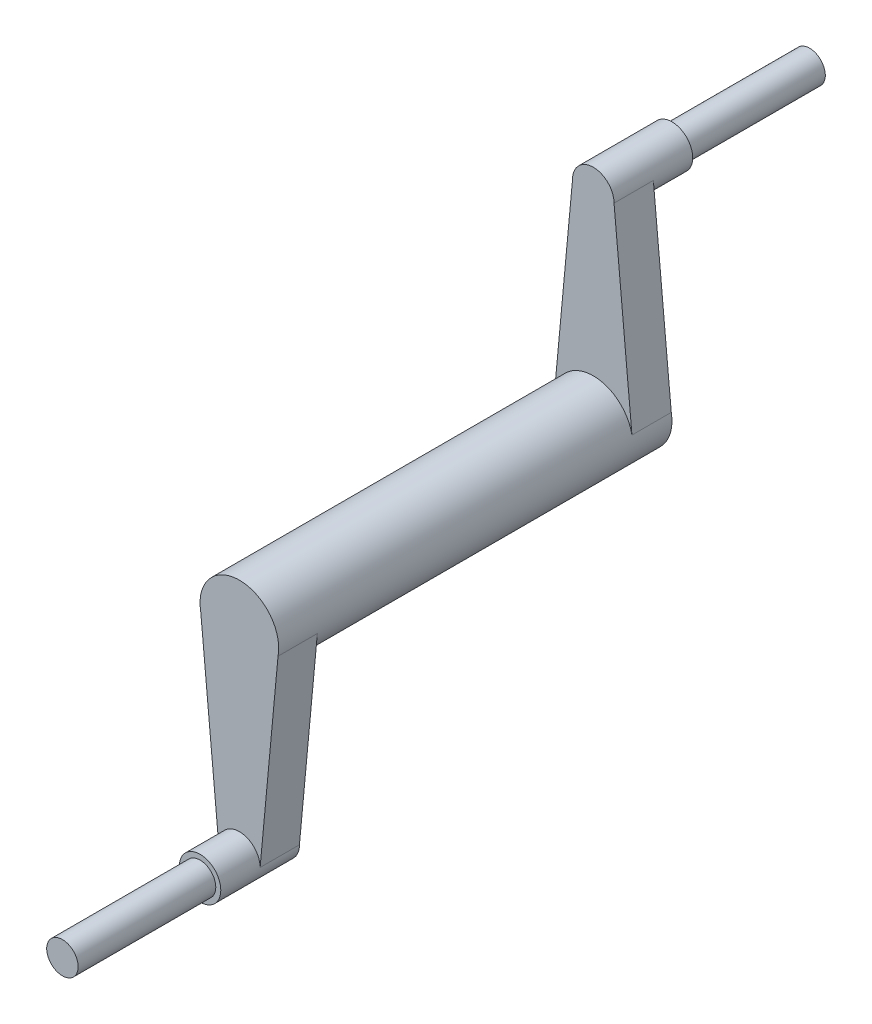
ISO-10303-21;
HEADER;
FILE_DESCRIPTION(('STEP AP214'),'2;1');
FILE_NAME('part.step','',(''),(''),'','','');
FILE_SCHEMA(('AUTOMOTIVE_DESIGN { 1 0 10303 214 1 1 1 1 }'));
ENDSEC;
DATA;
#1=APPLICATION_CONTEXT('core data for automotive mechanical design processes');
#2=APPLICATION_PROTOCOL_DEFINITION('international standard','automotive_design',2000,#1);
#3=PRODUCT_CONTEXT('',#1,'mechanical');
#4=PRODUCT('Part','Part','',(#3));
#5=PRODUCT_RELATED_PRODUCT_CATEGORY('part','',(#4));
#6=PRODUCT_DEFINITION_FORMATION('','',#4);
#7=PRODUCT_DEFINITION_CONTEXT('part definition',#1,'design');
#8=PRODUCT_DEFINITION('design','',#6,#7);
#9=PRODUCT_DEFINITION_SHAPE('','',#8);
#10=(LENGTH_UNIT() NAMED_UNIT(*) SI_UNIT(.MILLI.,.METRE.));
#11=(NAMED_UNIT(*) PLANE_ANGLE_UNIT() SI_UNIT($,.RADIAN.));
#12=(NAMED_UNIT(*) SI_UNIT($,.STERADIAN.) SOLID_ANGLE_UNIT());
#13=UNCERTAINTY_MEASURE_WITH_UNIT(LENGTH_MEASURE(1.E-05),#10,'distance_accuracy_value','');
#14=(GEOMETRIC_REPRESENTATION_CONTEXT(3) GLOBAL_UNCERTAINTY_ASSIGNED_CONTEXT((#13)) GLOBAL_UNIT_ASSIGNED_CONTEXT((#10,
#11,#12)) REPRESENTATION_CONTEXT('',''));
#15=CARTESIAN_POINT('',(0.,0.,0.));
#16=DIRECTION('',(0.,0.,1.));
#17=DIRECTION('',(1.,0.,0.));
#18=AXIS2_PLACEMENT_3D('',#15,#16,#17);
#19=CARTESIAN_POINT('',(0.,101.307517591066,-120.));
#20=DIRECTION('',(0.,0.,-1.));
#21=DIRECTION('',(-1.,0.,0.));
#22=AXIS2_PLACEMENT_3D('',#19,#20,#21);
#23=PLANE('',#22);
#24=CARTESIAN_POINT('',(0.,101.307517591066,-120.));
#25=DIRECTION('',(0.,0.,-1.));
#26=DIRECTION('',(-1.,0.,0.));
#27=AXIS2_PLACEMENT_3D('',#24,#25,#26);
#28=CIRCLE('',#27,10.5484821562841);
#29=CARTESIAN_POINT('',(-10.5484821562841,101.307517591066,-120.));
#30=VERTEX_POINT('',#29);
#31=EDGE_CURVE('E321',#30,#30,#28,.T.);
#32=ORIENTED_EDGE('',*,*,#31,.T.);
#33=EDGE_LOOP('',(#32));
#34=FACE_BOUND('',#33,.T.);
#35=CARTESIAN_POINT('',(0.,101.307517591066,-120.));
#36=DIRECTION('',(0.,0.,-1.));
#37=DIRECTION('',(-1.,0.,0.));
#38=AXIS2_PLACEMENT_3D('',#35,#36,#37);
#39=CIRCLE('',#38,8.);
#40=CARTESIAN_POINT('',(-8.,101.307517591066,-120.));
#41=VERTEX_POINT('',#40);
#42=EDGE_CURVE('E145',#41,#41,#39,.T.);
#43=ORIENTED_EDGE('',*,*,#42,.F.);
#44=EDGE_LOOP('',(#43));
#45=FACE_BOUND('',#44,.T.);
#46=ADVANCED_FACE('F37',(#34,#45),#23,.T.);
#47=CARTESIAN_POINT('',(0.,0.,-100.));
#48=DIRECTION('',(0.,0.,-1.));
#49=DIRECTION('',(-1.,0.,0.));
#50=AXIS2_PLACEMENT_3D('',#47,#48,#49);
#51=PLANE('',#50);
#52=DIRECTION('',(0.0928919349935822,0.995676196568517,0.));
#53=VECTOR('',#52,1.);
#54=CARTESIAN_POINT('',(-20.,0.,-100.));
#55=LINE('',#54,#53);
#56=CARTESIAN_POINT('',(-19.6548435365259,3.69961154105196,-100.));
#57=VERTEX_POINT('',#56);
#58=CARTESIAN_POINT('',(-10.5484821562841,101.307517591066,-100.));
#59=VERTEX_POINT('',#58);
#60=EDGE_CURVE('E311',#57,#59,#55,.T.);
#61=ORIENTED_EDGE('',*,*,#60,.T.);
#62=CARTESIAN_POINT('',(0.,101.307517591066,-100.));
#63=DIRECTION('',(0.,0.,-1.));
#64=DIRECTION('',(-1.,0.,0.));
#65=AXIS2_PLACEMENT_3D('',#62,#63,#64);
#66=CIRCLE('',#65,10.5484821562841);
#67=CARTESIAN_POINT('',(10.5484821562841,101.307517591066,-100.));
#68=VERTEX_POINT('',#67);
#69=EDGE_CURVE('E314',#59,#68,#66,.F.);
#70=ORIENTED_EDGE('',*,*,#69,.T.);
#71=DIRECTION('',(-0.0928919349935822,0.995676196568517,0.));
#72=VECTOR('',#71,1.);
#73=CARTESIAN_POINT('',(20.,0.,-100.));
#74=LINE('',#73,#72);
#75=CARTESIAN_POINT('',(19.6548435365259,3.69961154105196,-100.));
#76=VERTEX_POINT('',#75);
#77=EDGE_CURVE('E307',#76,#68,#74,.T.);
#78=ORIENTED_EDGE('',*,*,#77,.F.);
#79=CARTESIAN_POINT('',(0.,0.,-100.));
#80=DIRECTION('',(0.,0.,-1.));
#81=DIRECTION('',(-1.,0.,0.));
#82=AXIS2_PLACEMENT_3D('',#79,#80,#81);
#83=CIRCLE('',#82,20.);
#84=EDGE_CURVE('E60',#76,#57,#83,.T.);
#85=ORIENTED_EDGE('',*,*,#84,.T.);
#86=EDGE_LOOP('',(#61,#70,#78,#85));
#87=FACE_BOUND('',#86,.T.);
#88=ADVANCED_FACE('F184',(#87),#51,.T.);
#89=CARTESIAN_POINT('',(0.,0.,100.));
#90=DIRECTION('',(0.,0.,-1.));
#91=DIRECTION('',(-1.,0.,0.));
#92=AXIS2_PLACEMENT_3D('',#89,#90,#91);
#93=CYLINDRICAL_SURFACE('',#92,20.);
#94=DIRECTION('',(0.,0.,-1.));
#95=VECTOR('',#94,1.);
#96=CARTESIAN_POINT('',(-5.99999999999999,-19.0787840283389,100.));
#97=LINE('',#96,#95);
#98=CARTESIAN_POINT('',(-6.,-19.0787840283389,8.));
#99=VERTEX_POINT('',#98);
#100=CARTESIAN_POINT('',(-6.,-19.0787840283389,-7.99999999999999));
#101=VERTEX_POINT('',#100);
#102=EDGE_CURVE('E150',#99,#101,#97,.T.);
#103=ORIENTED_EDGE('',*,*,#102,.F.);
#104=CARTESIAN_POINT('',(6.,-19.0787840283389,8.));
#105=CARTESIAN_POINT('',(6.00002230630954,-19.0787603919218,8.16466799491076));
#106=CARTESIAN_POINT('',(5.99322212828861,-19.0809150948054,8.32932738693038));
#107=CARTESIAN_POINT('',(5.96614198358439,-19.089408588524,8.65738942838457));
#108=CARTESIAN_POINT('',(5.94586504749983,-19.0957464386677,8.82079235201368));
#109=CARTESIAN_POINT('',(5.89206455668659,-19.1124126760415,9.14476679368419));
#110=CARTESIAN_POINT('',(5.85857463708937,-19.1227309292375,9.3053444279638));
#111=CARTESIAN_POINT('',(5.77865096251378,-19.1470349488515,9.62296230866847));
#112=CARTESIAN_POINT('',(5.73221686903431,-19.1610208111801,9.78000246246932));
#113=CARTESIAN_POINT('',(5.62682620459484,-19.1922338155173,10.0893825607235));
#114=CARTESIAN_POINT('',(5.56787702452553,-19.2094590438083,10.2417252187759));
#115=CARTESIAN_POINT('',(5.43788252899625,-19.2466621419291,10.5408741429016));
#116=CARTESIAN_POINT('',(5.36683271334057,-19.2666410353108,10.687678324328));
#117=CARTESIAN_POINT('',(5.21317247195195,-19.3087849542851,10.9747849452531));
#118=CARTESIAN_POINT('',(5.13056139609833,-19.3309501027959,11.1150870185297));
#119=CARTESIAN_POINT('',(4.95431913401973,-19.3768680311909,11.3883877986748));
#120=CARTESIAN_POINT('',(4.86068378223771,-19.4006214097184,11.5213837168722));
#121=CARTESIAN_POINT('',(4.66024014290223,-19.4497584548899,11.7828635732296));
#122=CARTESIAN_POINT('',(4.55313526362689,-19.4751691904069,11.9111151521982));
#123=CARTESIAN_POINT('',(4.32860344600266,-19.5263015189751,12.1582539370087));
#124=CARTESIAN_POINT('',(4.21117292654718,-19.5520232171847,12.2771378666711));
#125=CARTESIAN_POINT('',(3.96676059198591,-19.6030710031715,12.5047413951219));
#126=CARTESIAN_POINT('',(3.83977871873938,-19.6283970885393,12.6134609320288));
#127=CARTESIAN_POINT('',(3.5770569657621,-19.6779706962222,12.8200192544725));
#128=CARTESIAN_POINT('',(3.44131715512968,-19.7022182270443,12.917858125839));
#129=CARTESIAN_POINT('',(3.15899953964076,-19.7494715734221,13.1039097682599));
#130=CARTESIAN_POINT('',(3.01225429870653,-19.7724407517412,13.1918780463025));
#131=CARTESIAN_POINT('',(2.71155717798052,-19.8159158974823,13.355063794055));
#132=CARTESIAN_POINT('',(2.55760798995096,-19.8364227748921,13.430285978567));
#133=CARTESIAN_POINT('',(2.24348996032481,-19.8744001644265,13.5674164393714));
#134=CARTESIAN_POINT('',(2.08331997555618,-19.8918701152059,13.6293222547682));
#135=CARTESIAN_POINT('',(1.75801430484773,-19.923254535561,13.7392375024558));
#136=CARTESIAN_POINT('',(1.59288079897389,-19.9371705413066,13.7872529399682));
#137=CARTESIAN_POINT('',(1.26354510595574,-19.960709769643,13.8678255467277));
#138=CARTESIAN_POINT('',(1.09944808925078,-19.9704430293701,13.9007806269582));
#139=CARTESIAN_POINT('',(0.768952154148948,-19.9858966495547,13.9528719972864));
#140=CARTESIAN_POINT('',(0.602554181799295,-19.9916186120195,13.9720138041346));
#141=CARTESIAN_POINT('',(0.26864429974023,-19.9988929276978,13.9963199648569));
#142=CARTESIAN_POINT('',(0.101132356360976,-20.0004451543012,14.0014838943061));
#143=CARTESIAN_POINT('',(-0.23372090041086,-19.9993350985709,13.9977835949215));
#144=CARTESIAN_POINT('',(-0.401062216878502,-19.9966728935831,13.9889196235372));
#145=CARTESIAN_POINT('',(-0.728949940400308,-19.9873626800314,13.9577577883976));
#146=CARTESIAN_POINT('',(-0.889542117296654,-19.9808452710305,13.9358999900172));
#147=CARTESIAN_POINT('',(-1.20830021014906,-19.9641050678088,13.8793045182417));
#148=CARTESIAN_POINT('',(-1.36646528055415,-19.9538810115069,13.8445624577749));
#149=CARTESIAN_POINT('',(-1.67917461818938,-19.9300014175933,13.7625076983902));
#150=CARTESIAN_POINT('',(-1.83372008335732,-19.916347033335,13.7151992242771));
#151=CARTESIAN_POINT('',(-2.13828018933734,-19.885954581515,13.6083697289368));
#152=CARTESIAN_POINT('',(-2.2882931022387,-19.8692153547843,13.5488441160033));
#153=CARTESIAN_POINT('',(-2.58443507880942,-19.8328818557961,13.4173094204607));
#154=CARTESIAN_POINT('',(-2.7305012482212,-19.8132575095082,13.3451671028017));
#155=CARTESIAN_POINT('',(-3.0160963237542,-19.7717979578185,13.1893768526706));
#156=CARTESIAN_POINT('',(-3.15562296424241,-19.7499619943591,13.1057249716159));
#157=CARTESIAN_POINT('',(-3.42724384686891,-19.704643118031,12.9275130175587));
#158=CARTESIAN_POINT('',(-3.55933800314027,-19.681160186142,12.8329528185717));
#159=CARTESIAN_POINT('',(-3.81531376455355,-19.6331439703208,12.6335413215712));
#160=CARTESIAN_POINT('',(-3.93919513006484,-19.6086106557752,12.5286897234991));
#161=CARTESIAN_POINT('',(-4.18263653591652,-19.5581593507452,12.3051027565368));
#162=CARTESIAN_POINT('',(-4.30184428600933,-19.5322244988475,12.1859873205257));
#163=CARTESIAN_POINT('',(-4.52981041510267,-19.4806179410542,11.9381664964976));
#164=CARTESIAN_POINT('',(-4.63857214120815,-19.454946153239,11.8094642039191));
#165=CARTESIAN_POINT('',(-4.84504126060965,-19.4045581786367,11.5431596037615));
#166=CARTESIAN_POINT('',(-4.94274124635232,-19.3798426394128,11.4055514280994));
#167=CARTESIAN_POINT('',(-5.12628631686323,-19.3321023379674,11.1224409076672));
#168=CARTESIAN_POINT('',(-5.21213600998877,-19.3090769201297,10.9769416624216));
#169=CARTESIAN_POINT('',(-5.37223080367566,-19.2651525602885,10.6773648649068));
#170=CARTESIAN_POINT('',(-5.44634371437401,-19.2442786555291,10.523212921341));
#171=CARTESIAN_POINT('',(-5.58122691640503,-19.2055937237889,10.2088781586389));
#172=CARTESIAN_POINT('',(-5.64200266456203,-19.1877814448102,10.0486978375224));
#173=CARTESIAN_POINT('',(-5.74966145349631,-19.1557967477957,9.72356788165007));
#174=CARTESIAN_POINT('',(-5.79655912825487,-19.1416204978023,9.55862347343715));
#175=CARTESIAN_POINT('',(-5.87609462586438,-19.1173543231182,9.22510681954902));
#176=CARTESIAN_POINT('',(-5.90873902604377,-19.1072625137754,9.05653628495149));
#177=CARTESIAN_POINT('',(-5.95603131732401,-19.0925703406668,8.74006292976352));
#178=CARTESIAN_POINT('',(-5.97251971262425,-19.0874107715083,8.59245829064001));
#179=CARTESIAN_POINT('',(-5.99450261914155,-19.0805126306352,8.29657288752471));
#180=CARTESIAN_POINT('',(-6.00001329545508,-19.0787690288453,8.14829344042534));
#181=CARTESIAN_POINT('',(-6.,-19.0787840283389,8.));
#182=B_SPLINE_CURVE_WITH_KNOTS('',3,(#104,#105,#106,#107,#108,#109,#110,#111,#112,#113,#114,
#115,#116,#117,#118,#119,#120,#121,#122,#123,#124,#125,#126,#127,#128,#129,#130,#131,#132,#133,
#134,#135,#136,#137,#138,#139,#140,#141,#142,#143,#144,#145,#146,#147,#148,#149,#150,#151,#152,
#153,#154,#155,#156,#157,#158,#159,#160,#161,#162,#163,#164,#165,#166,#167,#168,#169,#170,#171,
#172,#173,#174,#175,#176,#177,#178,#179,#180,#181),.UNSPECIFIED.,.F.,.F.,(4,2,2,2,2,2,2,2,2,2,2,
2,2,2,2,2,2,2,2,2,2,2,2,2,2,2,2,2,2,2,2,2,2,2,2,2,2,2,4),(0.,0.493836284878936,0.98756155541217,
1.48003801924602,1.97252736296405,2.46472666795181,2.95710942192587,3.44951987503683,
3.94211698773001,4.44857898474593,4.95521732942467,5.46185875834846,5.96849619046395,
6.48574341264194,7.00279888450885,7.5199498274806,8.03687685551445,8.53921958328379,
9.04136157401789,9.5435188116382,10.0456668334346,10.531706521874,11.0179118582603,
11.5039539397551,11.9901790315928,12.4818885441265,12.9737671698834,13.4656514771114,
13.9575501300996,14.4684682486943,14.9792221093922,15.4903160010787,16.001210574562,
16.517502934493,17.0335836608614,17.549118241575,18.0644146711719,18.509813123396,
18.9545552237083),.UNSPECIFIED.);
#183=CARTESIAN_POINT('',(5.99999999999999,-19.0787840283389,7.99999999999999));
#184=VERTEX_POINT('',#183);
#185=EDGE_CURVE('E131',#184,#99,#182,.T.);
#186=ORIENTED_EDGE('',*,*,#185,.F.);
#187=DIRECTION('',(0.,0.,-1.));
#188=VECTOR('',#187,1.);
#189=CARTESIAN_POINT('',(5.99999999999999,-19.0787840283389,100.));
#190=LINE('',#189,#188);
#191=CARTESIAN_POINT('',(5.99999999999999,-19.0787840283389,-7.99999999999999));
#192=VERTEX_POINT('',#191);
#193=EDGE_CURVE('E142',#192,#184,#190,.F.);
#194=ORIENTED_EDGE('',*,*,#193,.F.);
#195=CARTESIAN_POINT('',(-6.,-19.0787840283389,-7.99999999999999));
#196=CARTESIAN_POINT('',(-6.00002230630954,-19.0787603919218,-8.16466799491076));
#197=CARTESIAN_POINT('',(-5.99322212828861,-19.0809150948054,-8.32932738693037));
#198=CARTESIAN_POINT('',(-5.96614198358439,-19.089408588524,-8.65738942838456));
#199=CARTESIAN_POINT('',(-5.94586504749983,-19.0957464386677,-8.82079235201368));
#200=CARTESIAN_POINT('',(-5.89206455668659,-19.1124126760415,-9.14476679368418));
#201=CARTESIAN_POINT('',(-5.85857463708937,-19.1227309292375,-9.3053444279638));
#202=CARTESIAN_POINT('',(-5.77865096251378,-19.1470349488515,-9.62296230866846));
#203=CARTESIAN_POINT('',(-5.73221686903431,-19.1610208111801,-9.78000246246932));
#204=CARTESIAN_POINT('',(-5.62682620459484,-19.1922338155173,-10.0893825607235));
#205=CARTESIAN_POINT('',(-5.56787702452553,-19.2094590438083,-10.2417252187759));
#206=CARTESIAN_POINT('',(-5.43788252899625,-19.2466621419291,-10.5408741429016));
#207=CARTESIAN_POINT('',(-5.36683271334057,-19.2666410353108,-10.687678324328));
#208=CARTESIAN_POINT('',(-5.21317247195195,-19.3087849542851,-10.9747849452531));
#209=CARTESIAN_POINT('',(-5.13056139609833,-19.3309501027959,-11.1150870185297));
#210=CARTESIAN_POINT('',(-4.95431913401973,-19.3768680311909,-11.3883877986748));
#211=CARTESIAN_POINT('',(-4.86068378223771,-19.4006214097184,-11.5213837168722));
#212=CARTESIAN_POINT('',(-4.66024014290223,-19.4497584548899,-11.7828635732296));
#213=CARTESIAN_POINT('',(-4.55313526362689,-19.4751691904069,-11.9111151521982));
#214=CARTESIAN_POINT('',(-4.32860344600266,-19.5263015189751,-12.1582539370087));
#215=CARTESIAN_POINT('',(-4.21117292654718,-19.5520232171847,-12.2771378666711));
#216=CARTESIAN_POINT('',(-3.96676059198591,-19.6030710031715,-12.5047413951219));
#217=CARTESIAN_POINT('',(-3.83977871873938,-19.6283970885393,-12.6134609320288));
#218=CARTESIAN_POINT('',(-3.5770569657621,-19.6779706962222,-12.8200192544725));
#219=CARTESIAN_POINT('',(-3.44131715512968,-19.7022182270443,-12.9178581258389));
#220=CARTESIAN_POINT('',(-3.15899953964076,-19.7494715734221,-13.1039097682599));
#221=CARTESIAN_POINT('',(-3.01225429870653,-19.7724407517412,-13.1918780463025));
#222=CARTESIAN_POINT('',(-2.71155717798052,-19.8159158974823,-13.355063794055));
#223=CARTESIAN_POINT('',(-2.55760798995096,-19.8364227748921,-13.430285978567));
#224=CARTESIAN_POINT('',(-2.24348996032481,-19.8744001644265,-13.5674164393714));
#225=CARTESIAN_POINT('',(-2.08331997555618,-19.8918701152059,-13.6293222547682));
#226=CARTESIAN_POINT('',(-1.75801430484772,-19.923254535561,-13.7392375024558));
#227=CARTESIAN_POINT('',(-1.59288079897389,-19.9371705413066,-13.7872529399682));
#228=CARTESIAN_POINT('',(-1.26354510595574,-19.960709769643,-13.8678255467277));
#229=CARTESIAN_POINT('',(-1.09944808925078,-19.9704430293701,-13.9007806269582));
#230=CARTESIAN_POINT('',(-0.768952154148946,-19.9858966495547,-13.9528719972864));
#231=CARTESIAN_POINT('',(-0.602554181799292,-19.9916186120195,-13.9720138041346));
#232=CARTESIAN_POINT('',(-0.268644299740228,-19.9988929276978,-13.9963199648568));
#233=CARTESIAN_POINT('',(-0.101132356360974,-20.0004451543012,-14.0014838943061));
#234=CARTESIAN_POINT('',(0.233720900410862,-19.9993350985709,-13.9977835949215));
#235=CARTESIAN_POINT('',(0.401062216878504,-19.9966728935831,-13.9889196235372));
#236=CARTESIAN_POINT('',(0.72894994040031,-19.9873626800314,-13.9577577883976));
#237=CARTESIAN_POINT('',(0.889542117296656,-19.9808452710305,-13.9358999900172));
#238=CARTESIAN_POINT('',(1.20830021014906,-19.9641050678088,-13.8793045182417));
#239=CARTESIAN_POINT('',(1.36646528055415,-19.9538810115069,-13.8445624577749));
#240=CARTESIAN_POINT('',(1.67917461818938,-19.9300014175933,-13.7625076983902));
#241=CARTESIAN_POINT('',(1.83372008335732,-19.916347033335,-13.7151992242771));
#242=CARTESIAN_POINT('',(2.13828018933734,-19.885954581515,-13.6083697289368));
#243=CARTESIAN_POINT('',(2.2882931022387,-19.8692153547843,-13.5488441160033));
#244=CARTESIAN_POINT('',(2.58443507880942,-19.8328818557961,-13.4173094204606));
#245=CARTESIAN_POINT('',(2.7305012482212,-19.8132575095082,-13.3451671028017));
#246=CARTESIAN_POINT('',(3.0160963237542,-19.7717979578185,-13.1893768526706));
#247=CARTESIAN_POINT('',(3.15562296424241,-19.7499619943591,-13.1057249716159));
#248=CARTESIAN_POINT('',(3.42724384686891,-19.704643118031,-12.9275130175587));
#249=CARTESIAN_POINT('',(3.55933800314027,-19.681160186142,-12.8329528185717));
#250=CARTESIAN_POINT('',(3.81531376455356,-19.6331439703208,-12.6335413215712));
#251=CARTESIAN_POINT('',(3.93919513006484,-19.6086106557752,-12.5286897234991));
#252=CARTESIAN_POINT('',(4.18263653591652,-19.5581593507452,-12.3051027565368));
#253=CARTESIAN_POINT('',(4.30184428600934,-19.5322244988475,-12.1859873205257));
#254=CARTESIAN_POINT('',(4.52981041510267,-19.4806179410542,-11.9381664964976));
#255=CARTESIAN_POINT('',(4.63857214120815,-19.454946153239,-11.8094642039191));
#256=CARTESIAN_POINT('',(4.84504126060965,-19.4045581786367,-11.5431596037615));
#257=CARTESIAN_POINT('',(4.94274124635232,-19.3798426394128,-11.4055514280994));
#258=CARTESIAN_POINT('',(5.12628631686324,-19.3321023379674,-11.1224409076672));
#259=CARTESIAN_POINT('',(5.21213600998877,-19.3090769201297,-10.9769416624216));
#260=CARTESIAN_POINT('',(5.37223080367566,-19.2651525602885,-10.6773648649068));
#261=CARTESIAN_POINT('',(5.44634371437402,-19.2442786555291,-10.5232129213409));
#262=CARTESIAN_POINT('',(5.58122691640503,-19.2055937237889,-10.2088781586389));
#263=CARTESIAN_POINT('',(5.64200266456204,-19.1877814448102,-10.0486978375224));
#264=CARTESIAN_POINT('',(5.74966145349631,-19.1557967477957,-9.72356788165006));
#265=CARTESIAN_POINT('',(5.79655912825487,-19.1416204978023,-9.55862347343714));
#266=CARTESIAN_POINT('',(5.87609462586438,-19.1173543231182,-9.22510681954901));
#267=CARTESIAN_POINT('',(5.90873902604377,-19.1072625137754,-9.05653628495148));
#268=CARTESIAN_POINT('',(5.95603131732401,-19.0925703406668,-8.74006292976351));
#269=CARTESIAN_POINT('',(5.97251971262426,-19.0874107715083,-8.59245829064001));
#270=CARTESIAN_POINT('',(5.99450261914156,-19.0805126306352,-8.2965728875247));
#271=CARTESIAN_POINT('',(6.00001329545509,-19.0787690288453,-8.14829344042534));
#272=CARTESIAN_POINT('',(6.,-19.0787840283389,-7.99999999999999));
#273=B_SPLINE_CURVE_WITH_KNOTS('',3,(#195,#196,#197,#198,#199,#200,#201,#202,#203,#204,#205,
#206,#207,#208,#209,#210,#211,#212,#213,#214,#215,#216,#217,#218,#219,#220,#221,#222,#223,#224,
#225,#226,#227,#228,#229,#230,#231,#232,#233,#234,#235,#236,#237,#238,#239,#240,#241,#242,#243,
#244,#245,#246,#247,#248,#249,#250,#251,#252,#253,#254,#255,#256,#257,#258,#259,#260,#261,#262,
#263,#264,#265,#266,#267,#268,#269,#270,#271,#272),.UNSPECIFIED.,.F.,.F.,(4,2,2,2,2,2,2,2,2,2,2,
2,2,2,2,2,2,2,2,2,2,2,2,2,2,2,2,2,2,2,2,2,2,2,2,2,2,2,4),(0.,0.493836284878934,0.98756155541217,
1.48003801924602,1.97252736296405,2.4647266679518,2.95710942192587,3.44951987503683,
3.94211698773001,4.44857898474592,4.95521732942467,5.46185875834846,5.96849619046395,
6.48574341264195,7.00279888450885,7.5199498274806,8.03687685551445,8.53921958328379,
9.04136157401789,9.54351881163821,10.0456668334346,10.531706521874,11.0179118582603,
11.5039539397551,11.9901790315928,12.4818885441265,12.9737671698834,13.4656514771114,
13.9575501300996,14.4684682486943,14.9792221093922,15.4903160010787,16.001210574562,
16.5175029344931,17.0335836608614,17.549118241575,18.0644146711719,18.509813123396,
18.9545552237083),.UNSPECIFIED.);
#274=EDGE_CURVE('E52',#101,#192,#273,.T.);
#275=ORIENTED_EDGE('',*,*,#274,.F.);
#276=EDGE_LOOP('',(#103,#186,#194,#275));
#277=FACE_BOUND('',#276,.T.);
#278=CARTESIAN_POINT('',(0.,0.,100.));
#279=DIRECTION('',(0.,0.,1.));
#280=DIRECTION('',(1.,0.,0.));
#281=AXIS2_PLACEMENT_3D('',#278,#279,#280);
#282=CIRCLE('',#281,20.);
#283=CARTESIAN_POINT('',(19.6545718120387,-3.7010548341537,100.));
#284=VERTEX_POINT('',#283);
#285=CARTESIAN_POINT('',(-19.6545718120387,-3.7010548341537,100.));
#286=VERTEX_POINT('',#285);
#287=EDGE_CURVE('E252',#284,#286,#282,.T.);
#288=ORIENTED_EDGE('',*,*,#287,.F.);
#289=DIRECTION('',(0.,0.,-1.));
#290=VECTOR('',#289,1.);
#291=CARTESIAN_POINT('',(19.6545718120387,-3.7010548341537,100.));
#292=LINE('',#291,#290);
#293=CARTESIAN_POINT('',(19.6545718120387,-3.70105483415374,80.));
#294=VERTEX_POINT('',#293);
#295=EDGE_CURVE('E282',#284,#294,#292,.T.);
#296=ORIENTED_EDGE('',*,*,#295,.T.);
#297=CARTESIAN_POINT('',(0.,0.,80.));
#298=DIRECTION('',(0.,0.,-1.));
#299=DIRECTION('',(-1.,0.,0.));
#300=AXIS2_PLACEMENT_3D('',#297,#298,#299);
#301=CIRCLE('',#300,20.);
#302=CARTESIAN_POINT('',(-19.6545718120387,-3.70105483415374,80.));
#303=VERTEX_POINT('',#302);
#304=EDGE_CURVE('E45',#294,#303,#301,.T.);
#305=ORIENTED_EDGE('',*,*,#304,.T.);
#306=DIRECTION('',(0.,0.,-1.));
#307=VECTOR('',#306,1.);
#308=CARTESIAN_POINT('',(-19.6545718120387,-3.7010548341537,100.));
#309=LINE('',#308,#307);
#310=EDGE_CURVE('E279',#303,#286,#309,.F.);
#311=ORIENTED_EDGE('',*,*,#310,.T.);
#312=EDGE_LOOP('',(#288,#296,#305,#311));
#313=FACE_BOUND('',#312,.T.);
#314=DIRECTION('',(0.,0.,-1.));
#315=VECTOR('',#314,1.);
#316=CARTESIAN_POINT('',(19.6548435365259,3.69961154105196,100.));
#317=LINE('',#316,#315);
#318=CARTESIAN_POINT('',(19.6548435365259,3.69961154105199,-80.));
#319=VERTEX_POINT('',#318);
#320=EDGE_CURVE('E296',#319,#76,#317,.T.);
#321=ORIENTED_EDGE('',*,*,#320,.F.);
#322=CARTESIAN_POINT('',(0.,0.,-80.));
#323=DIRECTION('',(0.,0.,-1.));
#324=DIRECTION('',(-1.,0.,0.));
#325=AXIS2_PLACEMENT_3D('',#322,#323,#324);
#326=CIRCLE('',#325,20.);
#327=CARTESIAN_POINT('',(-19.6548435365259,3.69961154105199,-80.));
#328=VERTEX_POINT('',#327);
#329=EDGE_CURVE('E11',#328,#319,#326,.T.);
#330=ORIENTED_EDGE('',*,*,#329,.F.);
#331=DIRECTION('',(0.,0.,-1.));
#332=VECTOR('',#331,1.);
#333=CARTESIAN_POINT('',(-19.6548435365259,3.69961154105196,100.));
#334=LINE('',#333,#332);
#335=EDGE_CURVE('E299',#328,#57,#334,.T.);
#336=ORIENTED_EDGE('',*,*,#335,.T.);
#337=ORIENTED_EDGE('',*,*,#84,.F.);
#338=EDGE_LOOP('',(#321,#330,#336,#337));
#339=FACE_BOUND('',#338,.T.);
#340=ADVANCED_FACE('F39',(#277,#313,#339),#93,.T.);
#341=CARTESIAN_POINT('',(0.,-101.307170503222,120.));
#342=DIRECTION('',(0.,0.,1.));
#343=DIRECTION('',(1.,0.,0.));
#344=AXIS2_PLACEMENT_3D('',#341,#342,#343);
#345=PLANE('',#344);
#346=CARTESIAN_POINT('',(0.,-101.307170503222,120.));
#347=DIRECTION('',(0.,0.,1.));
#348=DIRECTION('',(1.,0.,0.));
#349=AXIS2_PLACEMENT_3D('',#346,#347,#348);
#350=CIRCLE('',#349,10.5447625332431);
#351=CARTESIAN_POINT('',(10.5447625332431,-101.307170503222,120.));
#352=VERTEX_POINT('',#351);
#353=EDGE_CURVE('E268',#352,#352,#350,.T.);
#354=ORIENTED_EDGE('',*,*,#353,.T.);
#355=EDGE_LOOP('',(#354));
#356=FACE_BOUND('',#355,.T.);
#357=CARTESIAN_POINT('',(0.,-101.307170503222,120.));
#358=DIRECTION('',(0.,0.,1.));
#359=DIRECTION('',(1.,0.,0.));
#360=AXIS2_PLACEMENT_3D('',#357,#358,#359);
#361=CIRCLE('',#360,8.);
#362=CARTESIAN_POINT('',(8.,-101.307170503222,120.));
#363=VERTEX_POINT('',#362);
#364=EDGE_CURVE('E289',#363,#363,#361,.T.);
#365=ORIENTED_EDGE('',*,*,#364,.F.);
#366=EDGE_LOOP('',(#365));
#367=FACE_BOUND('',#366,.T.);
#368=ADVANCED_FACE('F222',(#356,#367),#345,.T.);
#369=CARTESIAN_POINT('',(0.,0.,100.));
#370=DIRECTION('',(0.,0.,1.));
#371=DIRECTION('',(1.,0.,0.));
#372=AXIS2_PLACEMENT_3D('',#369,#370,#371);
#373=PLANE('',#372);
#374=DIRECTION('',(0.0929284923962072,-0.995672785256767,0.));
#375=VECTOR('',#374,1.);
#376=CARTESIAN_POINT('',(-20.,0.,100.));
#377=LINE('',#376,#375);
#378=CARTESIAN_POINT('',(-10.5447625332431,-101.307170503222,100.));
#379=VERTEX_POINT('',#378);
#380=EDGE_CURVE('E246',#286,#379,#377,.T.);
#381=ORIENTED_EDGE('',*,*,#380,.T.);
#382=CARTESIAN_POINT('',(0.,-101.307170503222,100.));
#383=DIRECTION('',(0.,0.,1.));
#384=DIRECTION('',(1.,0.,0.));
#385=AXIS2_PLACEMENT_3D('',#382,#383,#384);
#386=CIRCLE('',#385,10.5447625332431);
#387=CARTESIAN_POINT('',(10.5447625332431,-101.307170503222,100.));
#388=VERTEX_POINT('',#387);
#389=EDGE_CURVE('E250',#379,#388,#386,.F.);
#390=ORIENTED_EDGE('',*,*,#389,.T.);
#391=DIRECTION('',(0.0929284923962072,0.995672785256767,0.));
#392=VECTOR('',#391,1.);
#393=CARTESIAN_POINT('',(20.,0.,100.));
#394=LINE('',#393,#392);
#395=EDGE_CURVE('E254',#388,#284,#394,.T.);
#396=ORIENTED_EDGE('',*,*,#395,.T.);
#397=ORIENTED_EDGE('',*,*,#287,.T.);
#398=EDGE_LOOP('',(#381,#390,#396,#397));
#399=FACE_BOUND('',#398,.T.);
#400=ADVANCED_FACE('F225',(#399),#373,.T.);
#401=CARTESIAN_POINT('',(0.,0.,80.));
#402=DIRECTION('',(0.,0.,-1.));
#403=DIRECTION('',(-1.,0.,0.));
#404=AXIS2_PLACEMENT_3D('',#401,#402,#403);
#405=PLANE('',#404);
#406=CARTESIAN_POINT('',(0.,-101.307170503222,80.));
#407=DIRECTION('',(0.,0.,1.));
#408=DIRECTION('',(1.,0.,0.));
#409=AXIS2_PLACEMENT_3D('',#406,#407,#408);
#410=CIRCLE('',#409,10.5447625332431);
#411=CARTESIAN_POINT('',(-10.5447625332431,-101.307170503222,80.));
#412=VERTEX_POINT('',#411);
#413=CARTESIAN_POINT('',(10.5447625332431,-101.307170503222,80.));
#414=VERTEX_POINT('',#413);
#415=EDGE_CURVE('E271',#412,#414,#410,.T.);
#416=ORIENTED_EDGE('',*,*,#415,.F.);
#417=DIRECTION('',(0.0929284923962072,-0.995672785256767,0.));
#418=VECTOR('',#417,1.);
#419=CARTESIAN_POINT('',(-20.,0.,80.));
#420=LINE('',#419,#418);
#421=EDGE_CURVE('E259',#303,#412,#420,.T.);
#422=ORIENTED_EDGE('',*,*,#421,.F.);
#423=ORIENTED_EDGE('',*,*,#304,.F.);
#424=DIRECTION('',(0.0929284923962072,0.995672785256767,0.));
#425=VECTOR('',#424,1.);
#426=CARTESIAN_POINT('',(20.,0.,80.));
#427=LINE('',#426,#425);
#428=EDGE_CURVE('E263',#414,#294,#427,.T.);
#429=ORIENTED_EDGE('',*,*,#428,.F.);
#430=EDGE_LOOP('',(#416,#422,#423,#429));
#431=FACE_BOUND('',#430,.T.);
#432=ADVANCED_FACE('F231',(#431),#405,.T.);
#433=CARTESIAN_POINT('',(20.,0.,80.));
#434=DIRECTION('',(0.995672785256767,-0.0929284923962072,0.));
#435=DIRECTION('',(0.0929284923962072,0.995672785256767,0.));
#436=AXIS2_PLACEMENT_3D('',#433,#434,#435);
#437=PLANE('',#436);
#438=ORIENTED_EDGE('',*,*,#295,.F.);
#439=ORIENTED_EDGE('',*,*,#395,.F.);
#440=DIRECTION('',(0.,0.,1.));
#441=VECTOR('',#440,1.);
#442=CARTESIAN_POINT('',(10.5447625332431,-101.307170503222,80.));
#443=LINE('',#442,#441);
#444=EDGE_CURVE('E262',#414,#388,#443,.T.);
#445=ORIENTED_EDGE('',*,*,#444,.F.);
#446=ORIENTED_EDGE('',*,*,#428,.T.);
#447=EDGE_LOOP('',(#438,#439,#445,#446));
#448=FACE_BOUND('',#447,.T.);
#449=ADVANCED_FACE('F234',(#448),#437,.T.);
#450=CARTESIAN_POINT('',(-20.,0.,80.));
#451=DIRECTION('',(-0.995672785256767,-0.0929284923962072,0.));
#452=DIRECTION('',(0.0929284923962072,-0.995672785256767,0.));
#453=AXIS2_PLACEMENT_3D('',#450,#451,#452);
#454=PLANE('',#453);
#455=ORIENTED_EDGE('',*,*,#310,.F.);
#456=ORIENTED_EDGE('',*,*,#421,.T.);
#457=DIRECTION('',(0.,0.,1.));
#458=VECTOR('',#457,1.);
#459=CARTESIAN_POINT('',(-10.5447625332431,-101.307170503222,80.));
#460=LINE('',#459,#458);
#461=EDGE_CURVE('E257',#412,#379,#460,.T.);
#462=ORIENTED_EDGE('',*,*,#461,.T.);
#463=ORIENTED_EDGE('',*,*,#380,.F.);
#464=EDGE_LOOP('',(#455,#456,#462,#463));
#465=FACE_BOUND('',#464,.T.);
#466=ADVANCED_FACE('F229',(#465),#454,.T.);
#467=CARTESIAN_POINT('',(0.,-101.307170503222,120.));
#468=DIRECTION('',(0.,0.,-1.));
#469=DIRECTION('',(-1.,0.,0.));
#470=AXIS2_PLACEMENT_3D('',#467,#468,#469);
#471=CYLINDRICAL_SURFACE('',#470,10.5447625332431);
#472=ORIENTED_EDGE('',*,*,#461,.F.);
#473=ORIENTED_EDGE('',*,*,#415,.T.);
#474=ORIENTED_EDGE('',*,*,#444,.T.);
#475=ORIENTED_EDGE('',*,*,#389,.F.);
#476=EDGE_LOOP('',(#472,#473,#474,#475));
#477=FACE_BOUND('',#476,.T.);
#478=ORIENTED_EDGE('',*,*,#353,.F.);
#479=EDGE_LOOP('',(#478));
#480=FACE_BOUND('',#479,.T.);
#481=ADVANCED_FACE('F220',(#477,#480),#471,.T.);
#482=CARTESIAN_POINT('',(0.,-101.307170503222,190.));
#483=DIRECTION('',(0.,0.,-1.));
#484=DIRECTION('',(-1.,0.,0.));
#485=AXIS2_PLACEMENT_3D('',#482,#483,#484);
#486=CYLINDRICAL_SURFACE('',#485,8.);
#487=CARTESIAN_POINT('',(0.,-101.307170503222,190.));
#488=DIRECTION('',(0.,0.,1.));
#489=DIRECTION('',(1.,0.,0.));
#490=AXIS2_PLACEMENT_3D('',#487,#488,#489);
#491=CIRCLE('',#490,8.);
#492=CARTESIAN_POINT('',(8.,-101.307170503222,190.));
#493=VERTEX_POINT('',#492);
#494=EDGE_CURVE('E287',#493,#493,#491,.T.);
#495=ORIENTED_EDGE('',*,*,#494,.F.);
#496=EDGE_LOOP('',(#495));
#497=FACE_BOUND('',#496,.T.);
#498=ORIENTED_EDGE('',*,*,#364,.T.);
#499=EDGE_LOOP('',(#498));
#500=FACE_BOUND('',#499,.T.);
#501=ADVANCED_FACE('F216',(#497,#500),#486,.T.);
#502=CARTESIAN_POINT('',(0.,-101.307170503222,190.));
#503=DIRECTION('',(0.,0.,1.));
#504=DIRECTION('',(1.,0.,0.));
#505=AXIS2_PLACEMENT_3D('',#502,#503,#504);
#506=PLANE('',#505);
#507=ORIENTED_EDGE('',*,*,#494,.T.);
#508=EDGE_LOOP('',(#507));
#509=FACE_BOUND('',#508,.T.);
#510=ADVANCED_FACE('F206',(#509),#506,.T.);
#511=CARTESIAN_POINT('',(0.,0.,-80.));
#512=DIRECTION('',(0.,0.,-1.));
#513=DIRECTION('',(-1.,0.,0.));
#514=AXIS2_PLACEMENT_3D('',#511,#512,#513);
#515=PLANE('',#514);
#516=CARTESIAN_POINT('',(0.,101.307517591066,-80.));
#517=DIRECTION('',(0.,0.,-1.));
#518=DIRECTION('',(-1.,0.,0.));
#519=AXIS2_PLACEMENT_3D('',#516,#517,#518);
#520=CIRCLE('',#519,10.5484821562841);
#521=CARTESIAN_POINT('',(-10.5484821562841,101.307517591066,-80.));
#522=VERTEX_POINT('',#521);
#523=CARTESIAN_POINT('',(10.5484821562841,101.307517591066,-80.));
#524=VERTEX_POINT('',#523);
#525=EDGE_CURVE('E322',#522,#524,#520,.T.);
#526=ORIENTED_EDGE('',*,*,#525,.F.);
#527=DIRECTION('',(0.0928919349935822,0.995676196568517,0.));
#528=VECTOR('',#527,1.);
#529=CARTESIAN_POINT('',(-20.,0.,-80.));
#530=LINE('',#529,#528);
#531=EDGE_CURVE('E310',#328,#522,#530,.T.);
#532=ORIENTED_EDGE('',*,*,#531,.F.);
#533=ORIENTED_EDGE('',*,*,#329,.T.);
#534=DIRECTION('',(-0.0928919349935822,0.995676196568517,0.));
#535=VECTOR('',#534,1.);
#536=CARTESIAN_POINT('',(20.,0.,-80.));
#537=LINE('',#536,#535);
#538=EDGE_CURVE('E305',#319,#524,#537,.T.);
#539=ORIENTED_EDGE('',*,*,#538,.T.);
#540=EDGE_LOOP('',(#526,#532,#533,#539));
#541=FACE_BOUND('',#540,.T.);
#542=ADVANCED_FACE('F202',(#541),#515,.F.);
#543=CARTESIAN_POINT('',(20.,0.,-80.));
#544=DIRECTION('',(-0.995676196568517,-0.0928919349935822,0.));
#545=DIRECTION('',(0.0928919349935822,-0.995676196568517,0.));
#546=AXIS2_PLACEMENT_3D('',#543,#544,#545);
#547=PLANE('',#546);
#548=ORIENTED_EDGE('',*,*,#538,.F.);
#549=ORIENTED_EDGE('',*,*,#320,.T.);
#550=ORIENTED_EDGE('',*,*,#77,.T.);
#551=DIRECTION('',(0.,0.,-1.));
#552=VECTOR('',#551,1.);
#553=CARTESIAN_POINT('',(10.5484821562841,101.307517591066,-80.));
#554=LINE('',#553,#552);
#555=EDGE_CURVE('E301',#524,#68,#554,.T.);
#556=ORIENTED_EDGE('',*,*,#555,.F.);
#557=EDGE_LOOP('',(#548,#549,#550,#556));
#558=FACE_BOUND('',#557,.T.);
#559=ADVANCED_FACE('F205',(#558),#547,.F.);
#560=CARTESIAN_POINT('',(-20.,0.,-80.));
#561=DIRECTION('',(-0.995676196568517,0.0928919349935822,0.));
#562=DIRECTION('',(-0.0928919349935822,-0.995676196568517,0.));
#563=AXIS2_PLACEMENT_3D('',#560,#561,#562);
#564=PLANE('',#563);
#565=ORIENTED_EDGE('',*,*,#335,.F.);
#566=ORIENTED_EDGE('',*,*,#531,.T.);
#567=DIRECTION('',(0.,0.,-1.));
#568=VECTOR('',#567,1.);
#569=CARTESIAN_POINT('',(-10.5484821562841,101.307517591066,-80.));
#570=LINE('',#569,#568);
#571=EDGE_CURVE('E302',#522,#59,#570,.T.);
#572=ORIENTED_EDGE('',*,*,#571,.T.);
#573=ORIENTED_EDGE('',*,*,#60,.F.);
#574=EDGE_LOOP('',(#565,#566,#572,#573));
#575=FACE_BOUND('',#574,.T.);
#576=ADVANCED_FACE('F200',(#575),#564,.T.);
#577=CARTESIAN_POINT('',(0.,101.307517591066,-120.));
#578=DIRECTION('',(0.,0.,1.));
#579=DIRECTION('',(1.,0.,0.));
#580=AXIS2_PLACEMENT_3D('',#577,#578,#579);
#581=CYLINDRICAL_SURFACE('',#580,10.5484821562841);
#582=ORIENTED_EDGE('',*,*,#31,.F.);
#583=EDGE_LOOP('',(#582));
#584=FACE_BOUND('',#583,.T.);
#585=ORIENTED_EDGE('',*,*,#525,.T.);
#586=ORIENTED_EDGE('',*,*,#555,.T.);
#587=ORIENTED_EDGE('',*,*,#69,.F.);
#588=ORIENTED_EDGE('',*,*,#571,.F.);
#589=EDGE_LOOP('',(#585,#586,#587,#588));
#590=FACE_BOUND('',#589,.T.);
#591=ADVANCED_FACE('F197',(#584,#590),#581,.T.);
#592=CARTESIAN_POINT('',(0.,101.307517591066,-190.));
#593=DIRECTION('',(0.,0.,1.));
#594=DIRECTION('',(1.,0.,0.));
#595=AXIS2_PLACEMENT_3D('',#592,#593,#594);
#596=CYLINDRICAL_SURFACE('',#595,8.);
#597=CARTESIAN_POINT('',(0.,101.307517591066,-190.));
#598=DIRECTION('',(0.,0.,-1.));
#599=DIRECTION('',(-1.,0.,0.));
#600=AXIS2_PLACEMENT_3D('',#597,#598,#599);
#601=CIRCLE('',#600,8.);
#602=CARTESIAN_POINT('',(-8.,101.307517591066,-190.));
#603=VERTEX_POINT('',#602);
#604=EDGE_CURVE('E324',#603,#603,#601,.T.);
#605=ORIENTED_EDGE('',*,*,#604,.F.);
#606=EDGE_LOOP('',(#605));
#607=FACE_BOUND('',#606,.T.);
#608=ORIENTED_EDGE('',*,*,#42,.T.);
#609=EDGE_LOOP('',(#608));
#610=FACE_BOUND('',#609,.T.);
#611=ADVANCED_FACE('F196',(#607,#610),#596,.T.);
#612=CARTESIAN_POINT('',(0.,101.307517591066,-190.));
#613=DIRECTION('',(0.,0.,-1.));
#614=DIRECTION('',(-1.,0.,0.));
#615=AXIS2_PLACEMENT_3D('',#612,#613,#614);
#616=PLANE('',#615);
#617=ORIENTED_EDGE('',*,*,#604,.T.);
#618=EDGE_LOOP('',(#617));
#619=FACE_BOUND('',#618,.T.);
#620=ADVANCED_FACE('F345',(#619),#616,.T.);
#621=CARTESIAN_POINT('',(0.,-111.852933036466,8.));
#622=DIRECTION('',(0.,1.,0.));
#623=DIRECTION('',(0.,0.,1.));
#624=AXIS2_PLACEMENT_3D('',#621,#622,#623);
#625=CYLINDRICAL_SURFACE('',#624,6.);
#626=ORIENTED_EDGE('',*,*,#185,.T.);
#627=DIRECTION('',(0.,1.,0.));
#628=VECTOR('',#627,1.);
#629=CARTESIAN_POINT('',(-6.,-111.852933036466,8.));
#630=LINE('',#629,#628);
#631=CARTESIAN_POINT('',(-6.,-16.,8.));
#632=VERTEX_POINT('',#631);
#633=EDGE_CURVE('E146',#99,#632,#630,.T.);
#634=ORIENTED_EDGE('',*,*,#633,.T.);
#635=CARTESIAN_POINT('',(0.,-16.,8.));
#636=DIRECTION('',(0.,1.,0.));
#637=DIRECTION('',(0.,0.,1.));
#638=AXIS2_PLACEMENT_3D('',#635,#636,#637);
#639=CIRCLE('',#638,6.);
#640=CARTESIAN_POINT('',(6.,-16.,8.));
#641=VERTEX_POINT('',#640);
#642=EDGE_CURVE('E134',#632,#641,#639,.T.);
#643=ORIENTED_EDGE('',*,*,#642,.T.);
#644=DIRECTION('',(0.,1.,0.));
#645=VECTOR('',#644,1.);
#646=CARTESIAN_POINT('',(6.,-111.852933036466,8.));
#647=LINE('',#646,#645);
#648=EDGE_CURVE('E127',#184,#641,#647,.T.);
#649=ORIENTED_EDGE('',*,*,#648,.F.);
#650=EDGE_LOOP('',(#626,#634,#643,#649));
#651=FACE_BOUND('',#650,.T.);
#652=ADVANCED_FACE('F129',(#651),#625,.F.);
#653=CARTESIAN_POINT('',(-6.,-111.852933036466,8.));
#654=DIRECTION('',(-1.,0.,0.));
#655=DIRECTION('',(0.,0.,1.));
#656=AXIS2_PLACEMENT_3D('',#653,#654,#655);
#657=PLANE('',#656);
#658=ORIENTED_EDGE('',*,*,#102,.T.);
#659=DIRECTION('',(0.,1.,0.));
#660=VECTOR('',#659,1.);
#661=CARTESIAN_POINT('',(-6.,-111.852933036466,-7.99999999999999));
#662=LINE('',#661,#660);
#663=CARTESIAN_POINT('',(-6.,-16.,-7.99999999999999));
#664=VERTEX_POINT('',#663);
#665=EDGE_CURVE('E331',#101,#664,#662,.T.);
#666=ORIENTED_EDGE('',*,*,#665,.T.);
#667=DIRECTION('',(0.,0.,1.));
#668=VECTOR('',#667,1.);
#669=CARTESIAN_POINT('',(-6.,-16.,8.));
#670=LINE('',#669,#668);
#671=EDGE_CURVE('E139',#664,#632,#670,.T.);
#672=ORIENTED_EDGE('',*,*,#671,.T.);
#673=ORIENTED_EDGE('',*,*,#633,.F.);
#674=EDGE_LOOP('',(#658,#666,#672,#673));
#675=FACE_BOUND('',#674,.T.);
#676=ADVANCED_FACE('F177',(#675),#657,.F.);
#677=CARTESIAN_POINT('',(0.,-111.852933036466,-7.99999999999999));
#678=DIRECTION('',(0.,1.,0.));
#679=DIRECTION('',(0.,0.,1.));
#680=AXIS2_PLACEMENT_3D('',#677,#678,#679);
#681=CYLINDRICAL_SURFACE('',#680,6.);
#682=ORIENTED_EDGE('',*,*,#274,.T.);
#683=DIRECTION('',(0.,1.,0.));
#684=VECTOR('',#683,1.);
#685=CARTESIAN_POINT('',(6.,-111.852933036466,-7.99999999999999));
#686=LINE('',#685,#684);
#687=CARTESIAN_POINT('',(6.,-16.,-7.99999999999999));
#688=VERTEX_POINT('',#687);
#689=EDGE_CURVE('E138',#192,#688,#686,.T.);
#690=ORIENTED_EDGE('',*,*,#689,.T.);
#691=CARTESIAN_POINT('',(0.,-16.,-7.99999999999999));
#692=DIRECTION('',(0.,1.,0.));
#693=DIRECTION('',(0.,0.,-1.));
#694=AXIS2_PLACEMENT_3D('',#691,#692,#693);
#695=CIRCLE('',#694,6.);
#696=EDGE_CURVE('E336',#688,#664,#695,.T.);
#697=ORIENTED_EDGE('',*,*,#696,.T.);
#698=ORIENTED_EDGE('',*,*,#665,.F.);
#699=EDGE_LOOP('',(#682,#690,#697,#698));
#700=FACE_BOUND('',#699,.T.);
#701=ADVANCED_FACE('F174',(#700),#681,.F.);
#702=CARTESIAN_POINT('',(6.,-111.852933036466,8.));
#703=DIRECTION('',(1.,0.,0.));
#704=DIRECTION('',(0.,0.,-1.));
#705=AXIS2_PLACEMENT_3D('',#702,#703,#704);
#706=PLANE('',#705);
#707=ORIENTED_EDGE('',*,*,#193,.T.);
#708=ORIENTED_EDGE('',*,*,#648,.T.);
#709=DIRECTION('',(0.,0.,-1.));
#710=VECTOR('',#709,1.);
#711=CARTESIAN_POINT('',(6.,-16.,8.));
#712=LINE('',#711,#710);
#713=EDGE_CURVE('E152',#641,#688,#712,.T.);
#714=ORIENTED_EDGE('',*,*,#713,.T.);
#715=ORIENTED_EDGE('',*,*,#689,.F.);
#716=EDGE_LOOP('',(#707,#708,#714,#715));
#717=FACE_BOUND('',#716,.T.);
#718=ADVANCED_FACE('F143',(#717),#706,.F.);
#719=CARTESIAN_POINT('',(0.,-16.,8.));
#720=DIRECTION('',(0.,1.,0.));
#721=DIRECTION('',(0.,0.,1.));
#722=AXIS2_PLACEMENT_3D('',#719,#720,#721);
#723=PLANE('',#722);
#724=ORIENTED_EDGE('',*,*,#642,.F.);
#725=ORIENTED_EDGE('',*,*,#671,.F.);
#726=ORIENTED_EDGE('',*,*,#696,.F.);
#727=ORIENTED_EDGE('',*,*,#713,.F.);
#728=EDGE_LOOP('',(#724,#725,#726,#727));
#729=FACE_BOUND('',#728,.T.);
#730=ADVANCED_FACE('F167',(#729),#723,.F.);
#731=CLOSED_SHELL('',(#46,#88,#340,#368,#400,#432,#449,#466,#481,#501,#510,#542,#559,#576,#591,
#611,#620,#652,#676,#701,#718,#730));
#732=MANIFOLD_SOLID_BREP('B2',#731);
#733=ADVANCED_BREP_SHAPE_REPRESENTATION('',(#18,#732),#14);
#734=SHAPE_DEFINITION_REPRESENTATION(#9,#733);
ENDSEC;
END-ISO-10303-21;
